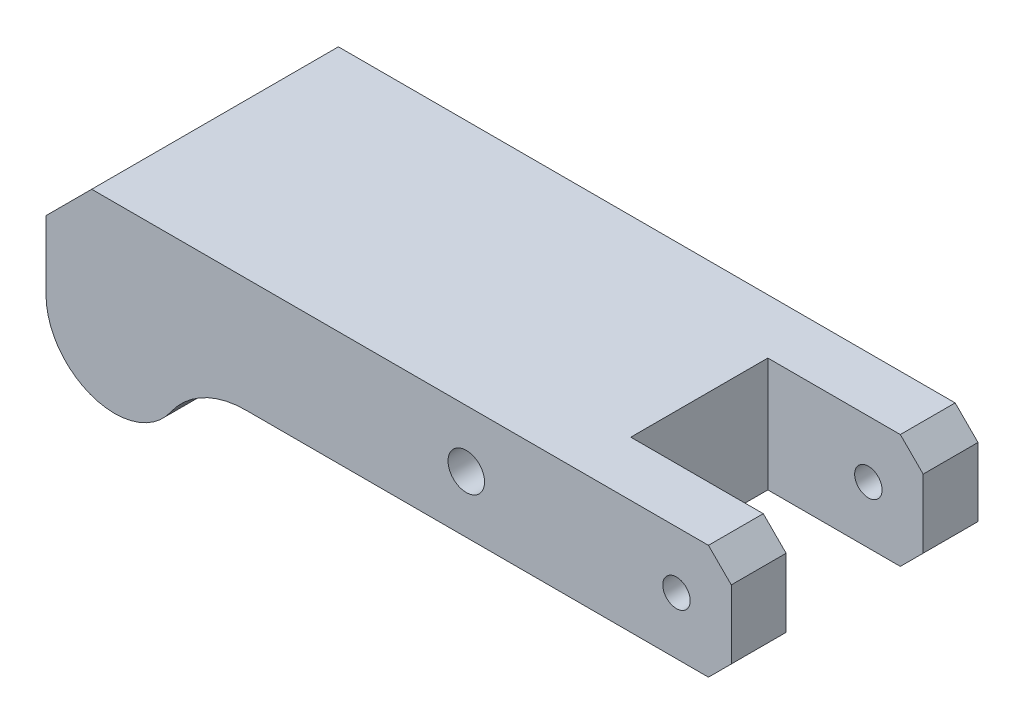
ISO-10303-21;
HEADER;
FILE_DESCRIPTION(('STEP AP214'),'2;1');
FILE_NAME('part.step','',(''),(''),'','','');
FILE_SCHEMA(('AUTOMOTIVE_DESIGN { 1 0 10303 214 1 1 1 1 }'));
ENDSEC;
DATA;
#1=APPLICATION_CONTEXT('core data for automotive mechanical design processes');
#2=APPLICATION_PROTOCOL_DEFINITION('international standard','automotive_design',2000,#1);
#3=PRODUCT_CONTEXT('',#1,'mechanical');
#4=PRODUCT('Part','Part','',(#3));
#5=PRODUCT_RELATED_PRODUCT_CATEGORY('part','',(#4));
#6=PRODUCT_DEFINITION_FORMATION('','',#4);
#7=PRODUCT_DEFINITION_CONTEXT('part definition',#1,'design');
#8=PRODUCT_DEFINITION('design','',#6,#7);
#9=PRODUCT_DEFINITION_SHAPE('','',#8);
#10=(LENGTH_UNIT() NAMED_UNIT(*) SI_UNIT(.MILLI.,.METRE.));
#11=(NAMED_UNIT(*) PLANE_ANGLE_UNIT() SI_UNIT($,.RADIAN.));
#12=(NAMED_UNIT(*) SI_UNIT($,.STERADIAN.) SOLID_ANGLE_UNIT());
#13=UNCERTAINTY_MEASURE_WITH_UNIT(LENGTH_MEASURE(1.E-05),#10,'distance_accuracy_value','');
#14=(GEOMETRIC_REPRESENTATION_CONTEXT(3) GLOBAL_UNCERTAINTY_ASSIGNED_CONTEXT((#13)) GLOBAL_UNIT_ASSIGNED_CONTEXT((#10,
#11,#12)) REPRESENTATION_CONTEXT('',''));
#15=CARTESIAN_POINT('',(0.,0.,0.));
#16=DIRECTION('',(0.,0.,1.));
#17=DIRECTION('',(1.,0.,0.));
#18=AXIS2_PLACEMENT_3D('',#15,#16,#17);
#19=CARTESIAN_POINT('',(75.,-12.5,54.));
#20=DIRECTION('',(-1.,0.,0.));
#21=DIRECTION('',(0.,0.,1.));
#22=AXIS2_PLACEMENT_3D('',#19,#20,#21);
#23=PLANE('',#22);
#24=DIRECTION('',(0.,1.,0.));
#25=VECTOR('',#24,1.);
#26=CARTESIAN_POINT('',(75.,-27.5,12.));
#27=LINE('',#26,#25);
#28=CARTESIAN_POINT('',(75.,-7.49999999999997,12.));
#29=VERTEX_POINT('',#28);
#30=CARTESIAN_POINT('',(75.,7.49999999999998,12.));
#31=VERTEX_POINT('',#30);
#32=EDGE_CURVE('E181',#29,#31,#27,.T.);
#33=ORIENTED_EDGE('',*,*,#32,.F.);
#34=DIRECTION('',(0.,0.,-1.));
#35=VECTOR('',#34,1.);
#36=CARTESIAN_POINT('',(75.,-7.49999999999997,54.));
#37=LINE('',#36,#35);
#38=CARTESIAN_POINT('',(75.,-7.49999999999997,0.));
#39=VERTEX_POINT('',#38);
#40=EDGE_CURVE('E292',#29,#39,#37,.T.);
#41=ORIENTED_EDGE('',*,*,#40,.T.);
#42=DIRECTION('',(0.,1.,0.));
#43=VECTOR('',#42,1.);
#44=CARTESIAN_POINT('',(75.,-12.5,0.));
#45=LINE('',#44,#43);
#46=CARTESIAN_POINT('',(75.,7.49999999999997,0.));
#47=VERTEX_POINT('',#46);
#48=EDGE_CURVE('E212',#39,#47,#45,.T.);
#49=ORIENTED_EDGE('',*,*,#48,.T.);
#50=DIRECTION('',(0.,0.,1.));
#51=VECTOR('',#50,1.);
#52=CARTESIAN_POINT('',(75.,7.49999999999998,54.));
#53=LINE('',#52,#51);
#54=EDGE_CURVE('E289',#47,#31,#53,.T.);
#55=ORIENTED_EDGE('',*,*,#54,.T.);
#56=EDGE_LOOP('',(#33,#41,#49,#55));
#57=FACE_BOUND('',#56,.T.);
#58=ADVANCED_FACE('F39',(#57),#23,.F.);
#59=CARTESIAN_POINT('',(-75.,12.5,54.));
#60=DIRECTION('',(0.,-1.,0.));
#61=DIRECTION('',(0.,0.,-1.));
#62=AXIS2_PLACEMENT_3D('',#59,#60,#61);
#63=PLANE('',#62);
#64=DIRECTION('',(1.,0.,0.));
#65=VECTOR('',#64,1.);
#66=CARTESIAN_POINT('',(0.,12.5,12.));
#67=LINE('',#66,#65);
#68=CARTESIAN_POINT('',(40.9999999999999,12.5,12.));
#69=VERTEX_POINT('',#68);
#70=CARTESIAN_POINT('',(70.,12.5,12.));
#71=VERTEX_POINT('',#70);
#72=EDGE_CURVE('E165',#69,#71,#67,.T.);
#73=ORIENTED_EDGE('',*,*,#72,.T.);
#74=DIRECTION('',(0.,0.,-1.));
#75=VECTOR('',#74,1.);
#76=CARTESIAN_POINT('',(70.,12.5,54.));
#77=LINE('',#76,#75);
#78=CARTESIAN_POINT('',(70.,12.5,0.));
#79=VERTEX_POINT('',#78);
#80=EDGE_CURVE('E11',#71,#79,#77,.T.);
#81=ORIENTED_EDGE('',*,*,#80,.T.);
#82=DIRECTION('',(-1.,0.,0.));
#83=VECTOR('',#82,1.);
#84=CARTESIAN_POINT('',(-75.,12.5,0.));
#85=LINE('',#84,#83);
#86=CARTESIAN_POINT('',(-65.,12.5,0.));
#87=VERTEX_POINT('',#86);
#88=EDGE_CURVE('E240',#79,#87,#85,.T.);
#89=ORIENTED_EDGE('',*,*,#88,.T.);
#90=DIRECTION('',(0.,0.,1.));
#91=VECTOR('',#90,1.);
#92=CARTESIAN_POINT('',(-65.,12.5,54.));
#93=LINE('',#92,#91);
#94=CARTESIAN_POINT('',(-65.,12.5,54.));
#95=VERTEX_POINT('',#94);
#96=EDGE_CURVE('E282',#87,#95,#93,.T.);
#97=ORIENTED_EDGE('',*,*,#96,.T.);
#98=DIRECTION('',(-1.,0.,0.));
#99=VECTOR('',#98,1.);
#100=CARTESIAN_POINT('',(-75.,12.5,54.));
#101=LINE('',#100,#99);
#102=CARTESIAN_POINT('',(70.,12.5,54.));
#103=VERTEX_POINT('',#102);
#104=EDGE_CURVE('E219',#103,#95,#101,.T.);
#105=ORIENTED_EDGE('',*,*,#104,.F.);
#106=DIRECTION('',(0.,0.,-1.));
#107=VECTOR('',#106,1.);
#108=CARTESIAN_POINT('',(70.,12.5,54.));
#109=LINE('',#108,#107);
#110=CARTESIAN_POINT('',(70.,12.5,42.));
#111=VERTEX_POINT('',#110);
#112=EDGE_CURVE('E48',#103,#111,#109,.T.);
#113=ORIENTED_EDGE('',*,*,#112,.T.);
#114=DIRECTION('',(1.,0.,0.));
#115=VECTOR('',#114,1.);
#116=CARTESIAN_POINT('',(0.,12.5,42.));
#117=LINE('',#116,#115);
#118=CARTESIAN_POINT('',(40.9999999999999,12.5,42.));
#119=VERTEX_POINT('',#118);
#120=EDGE_CURVE('E162',#119,#111,#117,.T.);
#121=ORIENTED_EDGE('',*,*,#120,.F.);
#122=DIRECTION('',(0.,0.,-1.));
#123=VECTOR('',#122,1.);
#124=CARTESIAN_POINT('',(40.9999999999999,12.5,0.));
#125=LINE('',#124,#123);
#126=EDGE_CURVE('E153',#119,#69,#125,.T.);
#127=ORIENTED_EDGE('',*,*,#126,.T.);
#128=EDGE_LOOP('',(#73,#81,#89,#97,#105,#113,#121,#127));
#129=FACE_BOUND('',#128,.T.);
#130=ADVANCED_FACE('F174',(#129),#63,.F.);
#131=CARTESIAN_POINT('',(-31.2771867673099,-12.5,54.));
#132=DIRECTION('',(0.,1.,0.));
#133=DIRECTION('',(-1.,0.,0.));
#134=AXIS2_PLACEMENT_3D('',#131,#132,#133);
#135=PLANE('',#134);
#136=DIRECTION('',(1.,0.,0.));
#137=VECTOR('',#136,1.);
#138=CARTESIAN_POINT('',(-31.2771867673099,-12.5,0.));
#139=LINE('',#138,#137);
#140=CARTESIAN_POINT('',(-31.2771867673099,-12.5,0.));
#141=VERTEX_POINT('',#140);
#142=CARTESIAN_POINT('',(69.9999999999999,-12.5,0.));
#143=VERTEX_POINT('',#142);
#144=EDGE_CURVE('E220',#141,#143,#139,.T.);
#145=ORIENTED_EDGE('',*,*,#144,.T.);
#146=DIRECTION('',(0.,0.,1.));
#147=VECTOR('',#146,1.);
#148=CARTESIAN_POINT('',(69.9999999999999,-12.5,54.));
#149=LINE('',#148,#147);
#150=CARTESIAN_POINT('',(69.9999999999999,-12.5,12.));
#151=VERTEX_POINT('',#150);
#152=EDGE_CURVE('E305',#143,#151,#149,.T.);
#153=ORIENTED_EDGE('',*,*,#152,.T.);
#154=DIRECTION('',(1.,0.,0.));
#155=VECTOR('',#154,1.);
#156=CARTESIAN_POINT('',(-31.2771867673099,-12.5,12.));
#157=LINE('',#156,#155);
#158=CARTESIAN_POINT('',(40.9999999999999,-12.5,12.));
#159=VERTEX_POINT('',#158);
#160=EDGE_CURVE('E196',#159,#151,#157,.T.);
#161=ORIENTED_EDGE('',*,*,#160,.F.);
#162=DIRECTION('',(0.,0.,-1.));
#163=VECTOR('',#162,1.);
#164=CARTESIAN_POINT('',(40.9999999999999,-12.5,54.));
#165=LINE('',#164,#163);
#166=CARTESIAN_POINT('',(40.9999999999999,-12.5,42.));
#167=VERTEX_POINT('',#166);
#168=EDGE_CURVE('E156',#167,#159,#165,.T.);
#169=ORIENTED_EDGE('',*,*,#168,.F.);
#170=DIRECTION('',(1.,0.,0.));
#171=VECTOR('',#170,1.);
#172=CARTESIAN_POINT('',(-31.2771867673099,-12.5,42.));
#173=LINE('',#172,#171);
#174=CARTESIAN_POINT('',(69.9999999999999,-12.5,42.));
#175=VERTEX_POINT('',#174);
#176=EDGE_CURVE('E191',#167,#175,#173,.T.);
#177=ORIENTED_EDGE('',*,*,#176,.T.);
#178=DIRECTION('',(0.,0.,1.));
#179=VECTOR('',#178,1.);
#180=CARTESIAN_POINT('',(69.9999999999999,-12.5,54.));
#181=LINE('',#180,#179);
#182=CARTESIAN_POINT('',(69.9999999999999,-12.5,54.));
#183=VERTEX_POINT('',#182);
#184=EDGE_CURVE('E302',#175,#183,#181,.T.);
#185=ORIENTED_EDGE('',*,*,#184,.T.);
#186=DIRECTION('',(1.,0.,0.));
#187=VECTOR('',#186,1.);
#188=CARTESIAN_POINT('',(-31.2771867673099,-12.5,54.));
#189=LINE('',#188,#187);
#190=CARTESIAN_POINT('',(-31.2771867673099,-12.5,54.));
#191=VERTEX_POINT('',#190);
#192=EDGE_CURVE('E232',#191,#183,#189,.T.);
#193=ORIENTED_EDGE('',*,*,#192,.F.);
#194=DIRECTION('',(0.,0.,-1.));
#195=VECTOR('',#194,1.);
#196=CARTESIAN_POINT('',(-31.2771867673099,-12.5,54.));
#197=LINE('',#196,#195);
#198=EDGE_CURVE('E236',#191,#141,#197,.T.);
#199=ORIENTED_EDGE('',*,*,#198,.T.);
#200=EDGE_LOOP('',(#145,#153,#161,#169,#177,#185,#193,#199));
#201=FACE_BOUND('',#200,.T.);
#202=ADVANCED_FACE('F336',(#201),#135,.F.);
#203=CARTESIAN_POINT('',(63.,0.,54.));
#204=DIRECTION('',(0.,0.,-1.));
#205=DIRECTION('',(-1.,0.,0.));
#206=AXIS2_PLACEMENT_3D('',#203,#204,#205);
#207=CYLINDRICAL_SURFACE('',#206,2.99999999999999);
#208=CARTESIAN_POINT('',(63.,0.,0.));
#209=DIRECTION('',(0.,0.,1.));
#210=DIRECTION('',(1.,0.,0.));
#211=AXIS2_PLACEMENT_3D('',#208,#209,#210);
#212=CIRCLE('',#211,2.99999999999999);
#213=CARTESIAN_POINT('',(65.9999999999999,0.,0.));
#214=VERTEX_POINT('',#213);
#215=EDGE_CURVE('E204',#214,#214,#212,.T.);
#216=ORIENTED_EDGE('',*,*,#215,.F.);
#217=EDGE_LOOP('',(#216));
#218=FACE_BOUND('',#217,.T.);
#219=CARTESIAN_POINT('',(63.,0.,12.));
#220=DIRECTION('',(0.,0.,1.));
#221=DIRECTION('',(1.,0.,0.));
#222=AXIS2_PLACEMENT_3D('',#219,#220,#221);
#223=CIRCLE('',#222,2.99999999999999);
#224=CARTESIAN_POINT('',(65.9999999999999,0.,12.));
#225=VERTEX_POINT('',#224);
#226=EDGE_CURVE('E195',#225,#225,#223,.T.);
#227=ORIENTED_EDGE('',*,*,#226,.T.);
#228=EDGE_LOOP('',(#227));
#229=FACE_BOUND('',#228,.T.);
#230=ADVANCED_FACE('F404',(#218,#229),#207,.F.);
#231=CARTESIAN_POINT('',(-60.,-12.5,54.));
#232=DIRECTION('',(0.,0.,1.));
#233=DIRECTION('',(1.,0.,0.));
#234=AXIS2_PLACEMENT_3D('',#231,#232,#233);
#235=PLANE('',#234);
#236=CARTESIAN_POINT('',(63.,0.,54.));
#237=DIRECTION('',(0.,0.,1.));
#238=DIRECTION('',(1.,0.,0.));
#239=AXIS2_PLACEMENT_3D('',#236,#237,#238);
#240=CIRCLE('',#239,2.99999999999999);
#241=CARTESIAN_POINT('',(65.9999999999999,0.,54.));
#242=VERTEX_POINT('',#241);
#243=EDGE_CURVE('E208',#242,#242,#240,.T.);
#244=ORIENTED_EDGE('',*,*,#243,.F.);
#245=EDGE_LOOP('',(#244));
#246=FACE_BOUND('',#245,.T.);
#247=ORIENTED_EDGE('',*,*,#192,.T.);
#248=DIRECTION('',(-0.707106781186549,-0.707106781186547,0.));
#249=VECTOR('',#248,1.);
#250=CARTESIAN_POINT('',(4.99999999999975,-77.5,54.));
#251=LINE('',#250,#249);
#252=CARTESIAN_POINT('',(75.,-7.49999999999997,54.));
#253=VERTEX_POINT('',#252);
#254=EDGE_CURVE('E327',#183,#253,#251,.F.);
#255=ORIENTED_EDGE('',*,*,#254,.T.);
#256=DIRECTION('',(0.,1.,0.));
#257=VECTOR('',#256,1.);
#258=CARTESIAN_POINT('',(75.,-12.5,54.));
#259=LINE('',#258,#257);
#260=CARTESIAN_POINT('',(75.,7.49999999999997,54.));
#261=VERTEX_POINT('',#260);
#262=EDGE_CURVE('E216',#253,#261,#259,.T.);
#263=ORIENTED_EDGE('',*,*,#262,.T.);
#264=DIRECTION('',(0.707106781186546,-0.707106781186549,0.));
#265=VECTOR('',#264,1.);
#266=CARTESIAN_POINT('',(17.5000000000003,64.9999999999999,54.));
#267=LINE('',#266,#265);
#268=EDGE_CURVE('E55',#261,#103,#267,.F.);
#269=ORIENTED_EDGE('',*,*,#268,.T.);
#270=ORIENTED_EDGE('',*,*,#104,.T.);
#271=DIRECTION('',(0.707106781186549,0.707106781186546,0.));
#272=VECTOR('',#271,1.);
#273=CARTESIAN_POINT('',(-75.,2.50000000000005,54.));
#274=LINE('',#273,#272);
#275=CARTESIAN_POINT('',(-75.,2.50000000000003,54.));
#276=VERTEX_POINT('',#275);
#277=EDGE_CURVE('E286',#95,#276,#274,.F.);
#278=ORIENTED_EDGE('',*,*,#277,.T.);
#279=DIRECTION('',(0.,-1.,0.));
#280=VECTOR('',#279,1.);
#281=CARTESIAN_POINT('',(-75.,-12.5,54.));
#282=LINE('',#281,#280);
#283=CARTESIAN_POINT('',(-75.,-12.5,54.));
#284=VERTEX_POINT('',#283);
#285=EDGE_CURVE('E223',#276,#284,#282,.T.);
#286=ORIENTED_EDGE('',*,*,#285,.T.);
#287=CARTESIAN_POINT('',(-60.,-12.5,54.));
#288=DIRECTION('',(0.,0.,1.));
#289=DIRECTION('',(1.,0.,0.));
#290=AXIS2_PLACEMENT_3D('',#287,#288,#289);
#291=CIRCLE('',#290,15.);
#292=CARTESIAN_POINT('',(-47.6902229002757,-21.0714285714286,54.));
#293=VERTEX_POINT('',#292);
#294=EDGE_CURVE('E226',#284,#293,#291,.T.);
#295=ORIENTED_EDGE('',*,*,#294,.T.);
#296=CARTESIAN_POINT('',(-31.2771867673099,-32.5,54.));
#297=DIRECTION('',(0.,0.,-1.));
#298=DIRECTION('',(1.,0.,0.));
#299=AXIS2_PLACEMENT_3D('',#296,#297,#298);
#300=CIRCLE('',#299,20.);
#301=EDGE_CURVE('E229',#293,#191,#300,.T.);
#302=ORIENTED_EDGE('',*,*,#301,.T.);
#303=EDGE_LOOP('',(#247,#255,#263,#269,#270,#278,#286,#295,#302));
#304=FACE_BOUND('',#303,.T.);
#305=CARTESIAN_POINT('',(17.,0.,54.));
#306=DIRECTION('',(0.,0.,1.));
#307=DIRECTION('',(1.,0.,0.));
#308=AXIS2_PLACEMENT_3D('',#305,#306,#307);
#309=CIRCLE('',#308,4.);
#310=CARTESIAN_POINT('',(21.,0.,54.));
#311=VERTEX_POINT('',#310);
#312=EDGE_CURVE('E200',#311,#311,#309,.T.);
#313=ORIENTED_EDGE('',*,*,#312,.F.);
#314=EDGE_LOOP('',(#313));
#315=FACE_BOUND('',#314,.T.);
#316=ADVANCED_FACE('F361',(#246,#304,#315),#235,.T.);
#317=CARTESIAN_POINT('',(-60.,-12.5,0.));
#318=DIRECTION('',(0.,0.,1.));
#319=DIRECTION('',(1.,0.,0.));
#320=AXIS2_PLACEMENT_3D('',#317,#318,#319);
#321=PLANE('',#320);
#322=ORIENTED_EDGE('',*,*,#48,.F.);
#323=DIRECTION('',(0.707106781186549,0.707106781186547,0.));
#324=VECTOR('',#323,1.);
#325=CARTESIAN_POINT('',(75.,-7.49999999999997,0.));
#326=LINE('',#325,#324);
#327=EDGE_CURVE('E299',#39,#143,#326,.F.);
#328=ORIENTED_EDGE('',*,*,#327,.T.);
#329=ORIENTED_EDGE('',*,*,#144,.F.);
#330=CARTESIAN_POINT('',(-31.2771867673099,-32.5,0.));
#331=DIRECTION('',(0.,0.,-1.));
#332=DIRECTION('',(1.,0.,0.));
#333=AXIS2_PLACEMENT_3D('',#330,#331,#332);
#334=CIRCLE('',#333,20.);
#335=CARTESIAN_POINT('',(-47.6902229002757,-21.0714285714286,0.));
#336=VERTEX_POINT('',#335);
#337=EDGE_CURVE('E249',#336,#141,#334,.T.);
#338=ORIENTED_EDGE('',*,*,#337,.F.);
#339=CARTESIAN_POINT('',(-60.,-12.5,0.));
#340=DIRECTION('',(0.,0.,1.));
#341=DIRECTION('',(1.,0.,0.));
#342=AXIS2_PLACEMENT_3D('',#339,#340,#341);
#343=CIRCLE('',#342,15.);
#344=CARTESIAN_POINT('',(-75.,-12.5,0.));
#345=VERTEX_POINT('',#344);
#346=EDGE_CURVE('E246',#345,#336,#343,.T.);
#347=ORIENTED_EDGE('',*,*,#346,.F.);
#348=DIRECTION('',(0.,-1.,0.));
#349=VECTOR('',#348,1.);
#350=CARTESIAN_POINT('',(-75.,-12.5,0.));
#351=LINE('',#350,#349);
#352=CARTESIAN_POINT('',(-75.,2.50000000000003,0.));
#353=VERTEX_POINT('',#352);
#354=EDGE_CURVE('E243',#353,#345,#351,.T.);
#355=ORIENTED_EDGE('',*,*,#354,.F.);
#356=DIRECTION('',(-0.707106781186549,-0.707106781186546,0.));
#357=VECTOR('',#356,1.);
#358=CARTESIAN_POINT('',(-75.,2.50000000000003,0.));
#359=LINE('',#358,#357);
#360=EDGE_CURVE('E278',#353,#87,#359,.F.);
#361=ORIENTED_EDGE('',*,*,#360,.T.);
#362=ORIENTED_EDGE('',*,*,#88,.F.);
#363=DIRECTION('',(-0.707106781186546,0.707106781186549,0.));
#364=VECTOR('',#363,1.);
#365=CARTESIAN_POINT('',(70.,12.5,0.));
#366=LINE('',#365,#364);
#367=EDGE_CURVE('E296',#79,#47,#366,.F.);
#368=ORIENTED_EDGE('',*,*,#367,.T.);
#369=EDGE_LOOP('',(#322,#328,#329,#338,#347,#355,#361,#362,#368));
#370=FACE_BOUND('',#369,.T.);
#371=ORIENTED_EDGE('',*,*,#215,.T.);
#372=EDGE_LOOP('',(#371));
#373=FACE_BOUND('',#372,.T.);
#374=CARTESIAN_POINT('',(17.,0.,0.));
#375=DIRECTION('',(0.,0.,1.));
#376=DIRECTION('',(1.,0.,0.));
#377=AXIS2_PLACEMENT_3D('',#374,#375,#376);
#378=CIRCLE('',#377,4.);
#379=CARTESIAN_POINT('',(21.,0.,0.));
#380=VERTEX_POINT('',#379);
#381=EDGE_CURVE('E199',#380,#380,#378,.T.);
#382=ORIENTED_EDGE('',*,*,#381,.T.);
#383=EDGE_LOOP('',(#382));
#384=FACE_BOUND('',#383,.T.);
#385=ADVANCED_FACE('F347',(#370,#373,#384),#321,.F.);
#386=ORIENTED_EDGE('',*,*,#262,.F.);
#387=DIRECTION('',(0.,0.,-1.));
#388=VECTOR('',#387,1.);
#389=CARTESIAN_POINT('',(75.,-7.49999999999997,54.));
#390=LINE('',#389,#388);
#391=CARTESIAN_POINT('',(75.,-7.49999999999997,42.));
#392=VERTEX_POINT('',#391);
#393=EDGE_CURVE('E316',#253,#392,#390,.T.);
#394=ORIENTED_EDGE('',*,*,#393,.T.);
#395=DIRECTION('',(0.,1.,0.));
#396=VECTOR('',#395,1.);
#397=CARTESIAN_POINT('',(75.,-27.5,42.));
#398=LINE('',#397,#396);
#399=CARTESIAN_POINT('',(75.,7.49999999999998,42.));
#400=VERTEX_POINT('',#399);
#401=EDGE_CURVE('E185',#392,#400,#398,.T.);
#402=ORIENTED_EDGE('',*,*,#401,.T.);
#403=DIRECTION('',(0.,0.,1.));
#404=VECTOR('',#403,1.);
#405=CARTESIAN_POINT('',(75.,7.49999999999998,54.));
#406=LINE('',#405,#404);
#407=EDGE_CURVE('E313',#400,#261,#406,.T.);
#408=ORIENTED_EDGE('',*,*,#407,.T.);
#409=EDGE_LOOP('',(#386,#394,#402,#408));
#410=FACE_BOUND('',#409,.T.);
#411=ADVANCED_FACE('F382',(#410),#23,.F.);
#412=CARTESIAN_POINT('',(-75.,-12.5,54.));
#413=DIRECTION('',(1.,0.,0.));
#414=DIRECTION('',(0.,0.,-1.));
#415=AXIS2_PLACEMENT_3D('',#412,#413,#414);
#416=PLANE('',#415);
#417=ORIENTED_EDGE('',*,*,#285,.F.);
#418=DIRECTION('',(0.,0.,-1.));
#419=VECTOR('',#418,1.);
#420=CARTESIAN_POINT('',(-75.,2.50000000000003,54.));
#421=LINE('',#420,#419);
#422=EDGE_CURVE('E274',#276,#353,#421,.T.);
#423=ORIENTED_EDGE('',*,*,#422,.T.);
#424=ORIENTED_EDGE('',*,*,#354,.T.);
#425=DIRECTION('',(0.,0.,-1.));
#426=VECTOR('',#425,1.);
#427=CARTESIAN_POINT('',(-75.,-12.5,54.));
#428=LINE('',#427,#426);
#429=EDGE_CURVE('E262',#284,#345,#428,.T.);
#430=ORIENTED_EDGE('',*,*,#429,.F.);
#431=EDGE_LOOP('',(#417,#423,#424,#430));
#432=FACE_BOUND('',#431,.T.);
#433=ADVANCED_FACE('F365',(#432),#416,.F.);
#434=CARTESIAN_POINT('',(-60.,-12.5,54.));
#435=DIRECTION('',(0.,0.,-1.));
#436=DIRECTION('',(-1.,0.,0.));
#437=AXIS2_PLACEMENT_3D('',#434,#435,#436);
#438=CYLINDRICAL_SURFACE('',#437,15.);
#439=ORIENTED_EDGE('',*,*,#346,.T.);
#440=DIRECTION('',(0.,0.,-1.));
#441=VECTOR('',#440,1.);
#442=CARTESIAN_POINT('',(-47.6902229002757,-21.0714285714286,54.));
#443=LINE('',#442,#441);
#444=EDGE_CURVE('E258',#293,#336,#443,.T.);
#445=ORIENTED_EDGE('',*,*,#444,.F.);
#446=ORIENTED_EDGE('',*,*,#294,.F.);
#447=ORIENTED_EDGE('',*,*,#429,.T.);
#448=EDGE_LOOP('',(#439,#445,#446,#447));
#449=FACE_BOUND('',#448,.T.);
#450=ADVANCED_FACE('F369',(#449),#438,.T.);
#451=CARTESIAN_POINT('',(-31.2771867673099,-32.5,54.));
#452=DIRECTION('',(0.,0.,-1.));
#453=DIRECTION('',(-1.,0.,0.));
#454=AXIS2_PLACEMENT_3D('',#451,#452,#453);
#455=CYLINDRICAL_SURFACE('',#454,20.);
#456=ORIENTED_EDGE('',*,*,#337,.T.);
#457=ORIENTED_EDGE('',*,*,#198,.F.);
#458=ORIENTED_EDGE('',*,*,#301,.F.);
#459=ORIENTED_EDGE('',*,*,#444,.T.);
#460=EDGE_LOOP('',(#456,#457,#458,#459));
#461=FACE_BOUND('',#460,.T.);
#462=ADVANCED_FACE('F375',(#461),#455,.F.);
#463=CARTESIAN_POINT('',(63.,0.,42.));
#464=DIRECTION('',(0.,0.,1.));
#465=DIRECTION('',(1.,0.,0.));
#466=AXIS2_PLACEMENT_3D('',#463,#464,#465);
#467=CIRCLE('',#466,2.99999999999999);
#468=CARTESIAN_POINT('',(65.9999999999999,0.,42.));
#469=VERTEX_POINT('',#468);
#470=EDGE_CURVE('E184',#469,#469,#467,.T.);
#471=ORIENTED_EDGE('',*,*,#470,.F.);
#472=EDGE_LOOP('',(#471));
#473=FACE_BOUND('',#472,.T.);
#474=ORIENTED_EDGE('',*,*,#243,.T.);
#475=EDGE_LOOP('',(#474));
#476=FACE_BOUND('',#475,.T.);
#477=ADVANCED_FACE('F413',(#473,#476),#207,.F.);
#478=CARTESIAN_POINT('',(17.,0.,54.));
#479=DIRECTION('',(0.,0.,-1.));
#480=DIRECTION('',(-1.,0.,0.));
#481=AXIS2_PLACEMENT_3D('',#478,#479,#480);
#482=CYLINDRICAL_SURFACE('',#481,4.);
#483=ORIENTED_EDGE('',*,*,#312,.T.);
#484=EDGE_LOOP('',(#483));
#485=FACE_BOUND('',#484,.T.);
#486=ORIENTED_EDGE('',*,*,#381,.F.);
#487=EDGE_LOOP('',(#486));
#488=FACE_BOUND('',#487,.T.);
#489=ADVANCED_FACE('F430',(#485,#488),#482,.F.);
#490=CARTESIAN_POINT('',(40.9999999999999,-27.5,0.));
#491=DIRECTION('',(1.,0.,0.));
#492=DIRECTION('',(0.,0.,-1.));
#493=AXIS2_PLACEMENT_3D('',#490,#491,#492);
#494=PLANE('',#493);
#495=ORIENTED_EDGE('',*,*,#168,.T.);
#496=DIRECTION('',(0.,1.,0.));
#497=VECTOR('',#496,1.);
#498=CARTESIAN_POINT('',(40.9999999999999,-27.5,12.));
#499=LINE('',#498,#497);
#500=EDGE_CURVE('E149',#159,#69,#499,.T.);
#501=ORIENTED_EDGE('',*,*,#500,.T.);
#502=ORIENTED_EDGE('',*,*,#126,.F.);
#503=DIRECTION('',(0.,1.,0.));
#504=VECTOR('',#503,1.);
#505=CARTESIAN_POINT('',(40.9999999999999,-27.5,42.));
#506=LINE('',#505,#504);
#507=EDGE_CURVE('E161',#167,#119,#506,.T.);
#508=ORIENTED_EDGE('',*,*,#507,.F.);
#509=EDGE_LOOP('',(#495,#501,#502,#508));
#510=FACE_BOUND('',#509,.T.);
#511=ADVANCED_FACE('F151',(#510),#494,.T.);
#512=CARTESIAN_POINT('',(0.,-27.5,12.));
#513=DIRECTION('',(0.,0.,1.));
#514=DIRECTION('',(1.,0.,0.));
#515=AXIS2_PLACEMENT_3D('',#512,#513,#514);
#516=PLANE('',#515);
#517=ORIENTED_EDGE('',*,*,#226,.F.);
#518=EDGE_LOOP('',(#517));
#519=FACE_BOUND('',#518,.T.);
#520=ORIENTED_EDGE('',*,*,#160,.T.);
#521=DIRECTION('',(-0.707106781186549,-0.707106781186547,0.));
#522=VECTOR('',#521,1.);
#523=CARTESIAN_POINT('',(27.4999999999999,-54.9999999999999,12.));
#524=LINE('',#523,#522);
#525=EDGE_CURVE('E310',#151,#29,#524,.F.);
#526=ORIENTED_EDGE('',*,*,#525,.T.);
#527=ORIENTED_EDGE('',*,*,#32,.T.);
#528=DIRECTION('',(0.707106781186546,-0.707106781186549,0.));
#529=VECTOR('',#528,1.);
#530=CARTESIAN_POINT('',(55.0000000000002,27.4999999999999,12.));
#531=LINE('',#530,#529);
#532=EDGE_CURVE('E169',#31,#71,#531,.F.);
#533=ORIENTED_EDGE('',*,*,#532,.T.);
#534=ORIENTED_EDGE('',*,*,#72,.F.);
#535=ORIENTED_EDGE('',*,*,#500,.F.);
#536=EDGE_LOOP('',(#520,#526,#527,#533,#534,#535));
#537=FACE_BOUND('',#536,.T.);
#538=ADVANCED_FACE('F166',(#519,#537),#516,.T.);
#539=CARTESIAN_POINT('',(0.,-27.5,42.));
#540=DIRECTION('',(0.,0.,1.));
#541=DIRECTION('',(1.,0.,0.));
#542=AXIS2_PLACEMENT_3D('',#539,#540,#541);
#543=PLANE('',#542);
#544=ORIENTED_EDGE('',*,*,#470,.T.);
#545=EDGE_LOOP('',(#544));
#546=FACE_BOUND('',#545,.T.);
#547=ORIENTED_EDGE('',*,*,#401,.F.);
#548=DIRECTION('',(0.707106781186549,0.707106781186547,0.));
#549=VECTOR('',#548,1.);
#550=CARTESIAN_POINT('',(75.,-7.49999999999997,42.));
#551=LINE('',#550,#549);
#552=EDGE_CURVE('E322',#392,#175,#551,.F.);
#553=ORIENTED_EDGE('',*,*,#552,.T.);
#554=ORIENTED_EDGE('',*,*,#176,.F.);
#555=ORIENTED_EDGE('',*,*,#507,.T.);
#556=ORIENTED_EDGE('',*,*,#120,.T.);
#557=DIRECTION('',(-0.707106781186546,0.707106781186549,0.));
#558=VECTOR('',#557,1.);
#559=CARTESIAN_POINT('',(70.,12.5,42.));
#560=LINE('',#559,#558);
#561=EDGE_CURVE('E63',#111,#400,#560,.F.);
#562=ORIENTED_EDGE('',*,*,#561,.T.);
#563=EDGE_LOOP('',(#547,#553,#554,#555,#556,#562));
#564=FACE_BOUND('',#563,.T.);
#565=ADVANCED_FACE('F332',(#546,#564),#543,.F.);
#566=CARTESIAN_POINT('',(-75.,2.50000000000003,54.));
#567=DIRECTION('',(0.707106781186546,-0.707106781186549,0.));
#568=DIRECTION('',(0.,0.,-1.));
#569=AXIS2_PLACEMENT_3D('',#566,#567,#568);
#570=PLANE('',#569);
#571=ORIENTED_EDGE('',*,*,#277,.F.);
#572=ORIENTED_EDGE('',*,*,#96,.F.);
#573=ORIENTED_EDGE('',*,*,#360,.F.);
#574=ORIENTED_EDGE('',*,*,#422,.F.);
#575=EDGE_LOOP('',(#571,#572,#573,#574));
#576=FACE_BOUND('',#575,.T.);
#577=ADVANCED_FACE('F359',(#576),#570,.F.);
#578=CARTESIAN_POINT('',(75.,-7.49999999999997,54.));
#579=DIRECTION('',(-0.707106781186546,0.707106781186548,0.));
#580=DIRECTION('',(0.,0.,-1.));
#581=AXIS2_PLACEMENT_3D('',#578,#579,#580);
#582=PLANE('',#581);
#583=ORIENTED_EDGE('',*,*,#525,.F.);
#584=ORIENTED_EDGE('',*,*,#152,.F.);
#585=ORIENTED_EDGE('',*,*,#327,.F.);
#586=ORIENTED_EDGE('',*,*,#40,.F.);
#587=EDGE_LOOP('',(#583,#584,#585,#586));
#588=FACE_BOUND('',#587,.T.);
#589=ADVANCED_FACE('F342',(#588),#582,.F.);
#590=CARTESIAN_POINT('',(75.,-7.49999999999997,54.));
#591=DIRECTION('',(-0.707106781186546,0.707106781186548,0.));
#592=DIRECTION('',(0.,0.,-1.));
#593=AXIS2_PLACEMENT_3D('',#590,#591,#592);
#594=PLANE('',#593);
#595=ORIENTED_EDGE('',*,*,#254,.F.);
#596=ORIENTED_EDGE('',*,*,#184,.F.);
#597=ORIENTED_EDGE('',*,*,#552,.F.);
#598=ORIENTED_EDGE('',*,*,#393,.F.);
#599=EDGE_LOOP('',(#595,#596,#597,#598));
#600=FACE_BOUND('',#599,.T.);
#601=ADVANCED_FACE('F378',(#600),#594,.F.);
#602=CARTESIAN_POINT('',(70.,12.5,54.));
#603=DIRECTION('',(-0.707106781186549,-0.707106781186545,0.));
#604=DIRECTION('',(0.,0.,-1.));
#605=AXIS2_PLACEMENT_3D('',#602,#603,#604);
#606=PLANE('',#605);
#607=ORIENTED_EDGE('',*,*,#532,.F.);
#608=ORIENTED_EDGE('',*,*,#54,.F.);
#609=ORIENTED_EDGE('',*,*,#367,.F.);
#610=ORIENTED_EDGE('',*,*,#80,.F.);
#611=EDGE_LOOP('',(#607,#608,#609,#610));
#612=FACE_BOUND('',#611,.T.);
#613=ADVANCED_FACE('F352',(#612),#606,.F.);
#614=CARTESIAN_POINT('',(70.,12.5,54.));
#615=DIRECTION('',(-0.707106781186549,-0.707106781186545,0.));
#616=DIRECTION('',(0.,0.,-1.));
#617=AXIS2_PLACEMENT_3D('',#614,#615,#616);
#618=PLANE('',#617);
#619=ORIENTED_EDGE('',*,*,#268,.F.);
#620=ORIENTED_EDGE('',*,*,#407,.F.);
#621=ORIENTED_EDGE('',*,*,#561,.F.);
#622=ORIENTED_EDGE('',*,*,#112,.F.);
#623=EDGE_LOOP('',(#619,#620,#621,#622));
#624=FACE_BOUND('',#623,.T.);
#625=ADVANCED_FACE('F41',(#624),#618,.F.);
#626=CLOSED_SHELL('',(#58,#130,#202,#230,#316,#385,#411,#433,#450,#462,#477,#489,#511,#538,#565,
#577,#589,#601,#613,#625));
#627=MANIFOLD_SOLID_BREP('B2',#626);
#628=ADVANCED_BREP_SHAPE_REPRESENTATION('',(#18,#627),#14);
#629=SHAPE_DEFINITION_REPRESENTATION(#9,#628);
ENDSEC;
END-ISO-10303-21;
